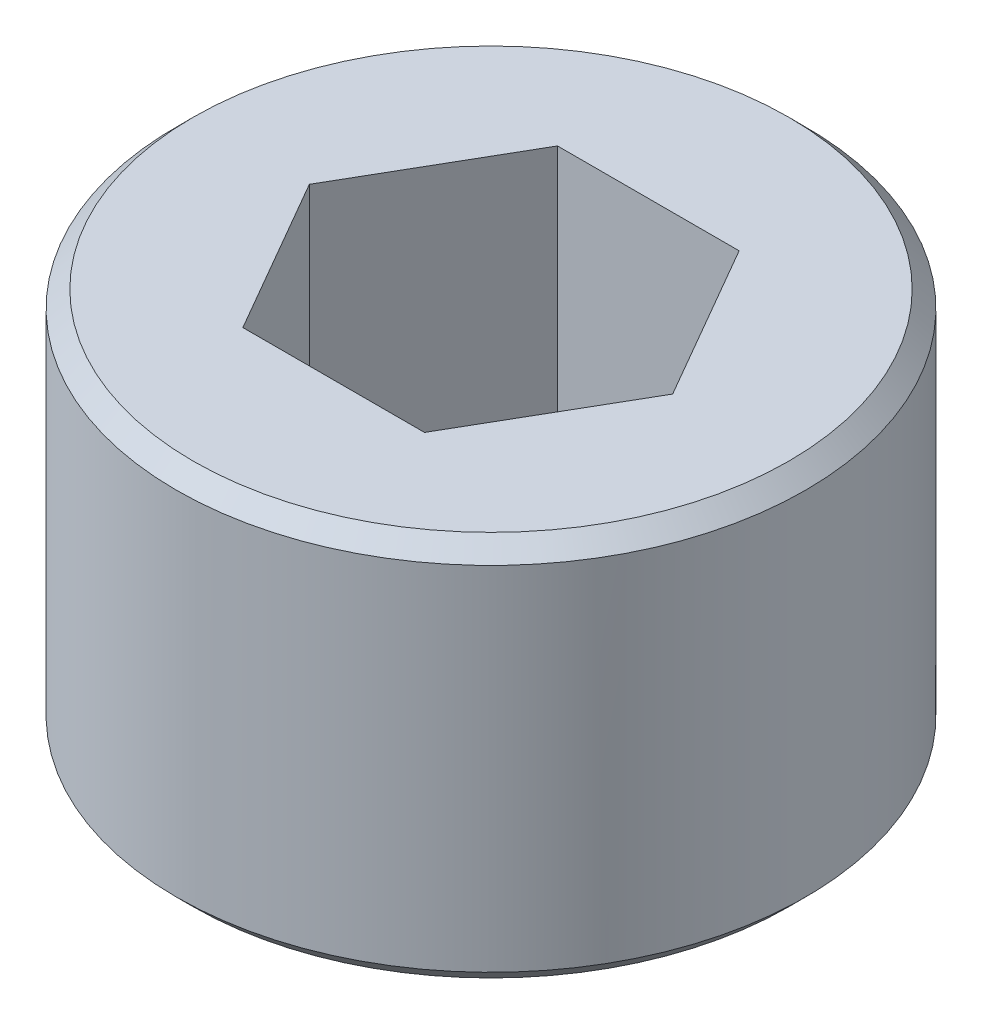
ISO-10303-21;
HEADER;
FILE_DESCRIPTION(('STEP AP214'),'2;1');
FILE_NAME('part.step','',(''),(''),'','','');
FILE_SCHEMA(('AUTOMOTIVE_DESIGN { 1 0 10303 214 1 1 1 1 }'));
ENDSEC;
DATA;
#1=APPLICATION_CONTEXT('core data for automotive mechanical design processes');
#2=APPLICATION_PROTOCOL_DEFINITION('international standard','automotive_design',2000,#1);
#3=PRODUCT_CONTEXT('',#1,'mechanical');
#4=PRODUCT('Part','Part','',(#3));
#5=PRODUCT_RELATED_PRODUCT_CATEGORY('part','',(#4));
#6=PRODUCT_DEFINITION_FORMATION('','',#4);
#7=PRODUCT_DEFINITION_CONTEXT('part definition',#1,'design');
#8=PRODUCT_DEFINITION('design','',#6,#7);
#9=PRODUCT_DEFINITION_SHAPE('','',#8);
#10=(LENGTH_UNIT() NAMED_UNIT(*) SI_UNIT(.MILLI.,.METRE.));
#11=(NAMED_UNIT(*) PLANE_ANGLE_UNIT() SI_UNIT($,.RADIAN.));
#12=(NAMED_UNIT(*) SI_UNIT($,.STERADIAN.) SOLID_ANGLE_UNIT());
#13=UNCERTAINTY_MEASURE_WITH_UNIT(LENGTH_MEASURE(1.E-05),#10,'distance_accuracy_value','');
#14=(GEOMETRIC_REPRESENTATION_CONTEXT(3) GLOBAL_UNCERTAINTY_ASSIGNED_CONTEXT((#13)) GLOBAL_UNIT_ASSIGNED_CONTEXT((#10,
#11,#12)) REPRESENTATION_CONTEXT('',''));
#15=CARTESIAN_POINT('',(0.,0.,0.));
#16=DIRECTION('',(0.,0.,1.));
#17=DIRECTION('',(1.,0.,0.));
#18=AXIS2_PLACEMENT_3D('',#15,#16,#17);
#19=CARTESIAN_POINT('',(-2.74963065701558,30.48,4.7625));
#20=DIRECTION('',(0.,0.,1.));
#21=DIRECTION('',(1.,0.,0.));
#22=AXIS2_PLACEMENT_3D('',#19,#20,#21);
#23=PLANE('',#22);
#24=DIRECTION('',(0.,1.,0.));
#25=VECTOR('',#24,1.);
#26=CARTESIAN_POINT('',(2.7496306570156,30.48,4.7625));
#27=LINE('',#26,#25);
#28=CARTESIAN_POINT('',(2.7496306570156,11.684,4.7625));
#29=VERTEX_POINT('',#28);
#30=CARTESIAN_POINT('',(2.7496306570156,0.,4.7625));
#31=VERTEX_POINT('',#30);
#32=EDGE_CURVE('E78',#29,#31,#27,.F.);
#33=ORIENTED_EDGE('',*,*,#32,.T.);
#34=DIRECTION('',(1.,0.,0.));
#35=VECTOR('',#34,1.);
#36=CARTESIAN_POINT('',(0.,0.,4.7625));
#37=LINE('',#36,#35);
#38=CARTESIAN_POINT('',(-2.74963065701558,0.,4.7625));
#39=VERTEX_POINT('',#38);
#40=EDGE_CURVE('E124',#31,#39,#37,.F.);
#41=ORIENTED_EDGE('',*,*,#40,.T.);
#42=DIRECTION('',(0.,1.,0.));
#43=VECTOR('',#42,1.);
#44=CARTESIAN_POINT('',(-2.74963065701559,30.48,4.76250000000001));
#45=LINE('',#44,#43);
#46=CARTESIAN_POINT('',(-2.74963065701558,11.684,4.7625));
#47=VERTEX_POINT('',#46);
#48=EDGE_CURVE('E101',#39,#47,#45,.T.);
#49=ORIENTED_EDGE('',*,*,#48,.T.);
#50=DIRECTION('',(1.,0.,0.));
#51=VECTOR('',#50,1.);
#52=CARTESIAN_POINT('',(0.,11.684,4.7625));
#53=LINE('',#52,#51);
#54=EDGE_CURVE('E86',#29,#47,#53,.F.);
#55=ORIENTED_EDGE('',*,*,#54,.F.);
#56=EDGE_LOOP('',(#33,#41,#49,#55));
#57=FACE_BOUND('',#56,.T.);
#58=ADVANCED_FACE('F17',(#57),#23,.F.);
#59=CARTESIAN_POINT('',(-5.49926131403119,30.48,0.));
#60=DIRECTION('',(-0.866025403784439,0.,0.5));
#61=DIRECTION('',(0.5,0.,0.866025403784439));
#62=AXIS2_PLACEMENT_3D('',#59,#60,#61);
#63=PLANE('',#62);
#64=ORIENTED_EDGE('',*,*,#48,.F.);
#65=DIRECTION('',(-0.500000000000002,0.,-0.866025403784437));
#66=VECTOR('',#65,1.);
#67=CARTESIAN_POINT('',(-2.74963065701558,0.,4.7625));
#68=LINE('',#67,#66);
#69=CARTESIAN_POINT('',(-5.49926131403119,0.,0.));
#70=VERTEX_POINT('',#69);
#71=EDGE_CURVE('E122',#39,#70,#68,.T.);
#72=ORIENTED_EDGE('',*,*,#71,.T.);
#73=DIRECTION('',(0.,1.,0.));
#74=VECTOR('',#73,1.);
#75=CARTESIAN_POINT('',(-5.49926131403118,30.48,0.));
#76=LINE('',#75,#74);
#77=CARTESIAN_POINT('',(-5.49926131403119,11.684,0.));
#78=VERTEX_POINT('',#77);
#79=EDGE_CURVE('E99',#70,#78,#76,.T.);
#80=ORIENTED_EDGE('',*,*,#79,.T.);
#81=DIRECTION('',(-0.500000000000002,0.,-0.866025403784437));
#82=VECTOR('',#81,1.);
#83=CARTESIAN_POINT('',(-2.74963065701558,11.684,4.7625));
#84=LINE('',#83,#82);
#85=EDGE_CURVE('E129',#47,#78,#84,.T.);
#86=ORIENTED_EDGE('',*,*,#85,.F.);
#87=EDGE_LOOP('',(#64,#72,#80,#86));
#88=FACE_BOUND('',#87,.T.);
#89=ADVANCED_FACE('F136',(#88),#63,.F.);
#90=CARTESIAN_POINT('',(-5.49926131403118,30.48,0.));
#91=DIRECTION('',(-0.866025403784438,0.,-0.500000000000001));
#92=DIRECTION('',(-0.500000000000001,0.,0.866025403784438));
#93=AXIS2_PLACEMENT_3D('',#90,#91,#92);
#94=PLANE('',#93);
#95=ORIENTED_EDGE('',*,*,#79,.F.);
#96=DIRECTION('',(0.500000000000003,0.,-0.866025403784437));
#97=VECTOR('',#96,1.);
#98=CARTESIAN_POINT('',(-5.49926131403119,0.,0.));
#99=LINE('',#98,#97);
#100=CARTESIAN_POINT('',(-2.74963065701558,0.,-4.7625));
#101=VERTEX_POINT('',#100);
#102=EDGE_CURVE('E120',#70,#101,#99,.T.);
#103=ORIENTED_EDGE('',*,*,#102,.T.);
#104=DIRECTION('',(0.,1.,0.));
#105=VECTOR('',#104,1.);
#106=CARTESIAN_POINT('',(-2.74963065701558,30.48,-4.7625));
#107=LINE('',#106,#105);
#108=CARTESIAN_POINT('',(-2.74963065701558,11.684,-4.7625));
#109=VERTEX_POINT('',#108);
#110=EDGE_CURVE('E97',#101,#109,#107,.T.);
#111=ORIENTED_EDGE('',*,*,#110,.T.);
#112=DIRECTION('',(0.500000000000003,0.,-0.866025403784437));
#113=VECTOR('',#112,1.);
#114=CARTESIAN_POINT('',(-5.49926131403119,11.684,0.));
#115=LINE('',#114,#113);
#116=EDGE_CURVE('E127',#78,#109,#115,.T.);
#117=ORIENTED_EDGE('',*,*,#116,.F.);
#118=EDGE_LOOP('',(#95,#103,#111,#117));
#119=FACE_BOUND('',#118,.T.);
#120=ADVANCED_FACE('F141',(#119),#94,.F.);
#121=CARTESIAN_POINT('',(-2.74963065701558,30.48,-4.7625));
#122=DIRECTION('',(0.,0.,-1.));
#123=DIRECTION('',(-1.,0.,0.));
#124=AXIS2_PLACEMENT_3D('',#121,#122,#123);
#125=PLANE('',#124);
#126=ORIENTED_EDGE('',*,*,#110,.F.);
#127=DIRECTION('',(1.,0.,0.));
#128=VECTOR('',#127,1.);
#129=CARTESIAN_POINT('',(0.,0.,-4.7625));
#130=LINE('',#129,#128);
#131=CARTESIAN_POINT('',(2.7496306570156,0.,-4.7625));
#132=VERTEX_POINT('',#131);
#133=EDGE_CURVE('E114',#101,#132,#130,.T.);
#134=ORIENTED_EDGE('',*,*,#133,.T.);
#135=DIRECTION('',(0.,1.,0.));
#136=VECTOR('',#135,1.);
#137=CARTESIAN_POINT('',(2.7496306570156,30.48,-4.7625));
#138=LINE('',#137,#136);
#139=CARTESIAN_POINT('',(2.7496306570156,11.684,-4.7625));
#140=VERTEX_POINT('',#139);
#141=EDGE_CURVE('E67',#132,#140,#138,.T.);
#142=ORIENTED_EDGE('',*,*,#141,.T.);
#143=DIRECTION('',(1.,0.,0.));
#144=VECTOR('',#143,1.);
#145=CARTESIAN_POINT('',(0.,11.684,-4.7625));
#146=LINE('',#145,#144);
#147=EDGE_CURVE('E91',#109,#140,#146,.T.);
#148=ORIENTED_EDGE('',*,*,#147,.F.);
#149=EDGE_LOOP('',(#126,#134,#142,#148));
#150=FACE_BOUND('',#149,.T.);
#151=ADVANCED_FACE('F144',(#150),#125,.F.);
#152=CARTESIAN_POINT('',(2.7496306570156,30.48,-4.7625));
#153=DIRECTION('',(0.866025403784439,0.,-0.5));
#154=DIRECTION('',(-0.5,0.,-0.866025403784439));
#155=AXIS2_PLACEMENT_3D('',#152,#153,#154);
#156=PLANE('',#155);
#157=ORIENTED_EDGE('',*,*,#141,.F.);
#158=DIRECTION('',(0.500000000000001,0.,0.866025403784438));
#159=VECTOR('',#158,1.);
#160=CARTESIAN_POINT('',(2.7496306570156,0.,-4.7625));
#161=LINE('',#160,#159);
#162=CARTESIAN_POINT('',(5.4992613140312,0.,0.));
#163=VERTEX_POINT('',#162);
#164=EDGE_CURVE('E35',#132,#163,#161,.T.);
#165=ORIENTED_EDGE('',*,*,#164,.T.);
#166=DIRECTION('',(0.,1.,0.));
#167=VECTOR('',#166,1.);
#168=CARTESIAN_POINT('',(5.4992613140312,30.48,0.));
#169=LINE('',#168,#167);
#170=CARTESIAN_POINT('',(5.4992613140312,11.684,0.));
#171=VERTEX_POINT('',#170);
#172=EDGE_CURVE('E69',#163,#171,#169,.T.);
#173=ORIENTED_EDGE('',*,*,#172,.T.);
#174=DIRECTION('',(0.500000000000001,0.,0.866025403784438));
#175=VECTOR('',#174,1.);
#176=CARTESIAN_POINT('',(2.7496306570156,11.684,-4.7625));
#177=LINE('',#176,#175);
#178=EDGE_CURVE('E73',#140,#171,#177,.T.);
#179=ORIENTED_EDGE('',*,*,#178,.F.);
#180=EDGE_LOOP('',(#157,#165,#173,#179));
#181=FACE_BOUND('',#180,.T.);
#182=ADVANCED_FACE('F71',(#181),#156,.F.);
#183=CARTESIAN_POINT('',(2.7496306570156,30.48,4.7625));
#184=DIRECTION('',(0.866025403784438,0.,0.500000000000001));
#185=DIRECTION('',(0.500000000000001,0.,-0.866025403784438));
#186=AXIS2_PLACEMENT_3D('',#183,#184,#185);
#187=PLANE('',#186);
#188=ORIENTED_EDGE('',*,*,#172,.F.);
#189=DIRECTION('',(-0.500000000000001,0.,0.866025403784438));
#190=VECTOR('',#189,1.);
#191=CARTESIAN_POINT('',(5.4992613140312,0.,0.));
#192=LINE('',#191,#190);
#193=EDGE_CURVE('E109',#163,#31,#192,.T.);
#194=ORIENTED_EDGE('',*,*,#193,.T.);
#195=ORIENTED_EDGE('',*,*,#32,.F.);
#196=DIRECTION('',(-0.500000000000001,0.,0.866025403784438));
#197=VECTOR('',#196,1.);
#198=CARTESIAN_POINT('',(5.4992613140312,11.684,0.));
#199=LINE('',#198,#197);
#200=EDGE_CURVE('E81',#171,#29,#199,.T.);
#201=ORIENTED_EDGE('',*,*,#200,.F.);
#202=EDGE_LOOP('',(#188,#194,#195,#201));
#203=FACE_BOUND('',#202,.T.);
#204=ADVANCED_FACE('F82',(#203),#187,.F.);
#205=CARTESIAN_POINT('',(0.,11.684,0.));
#206=DIRECTION('',(0.,1.,0.));
#207=DIRECTION('',(0.,0.,1.));
#208=AXIS2_PLACEMENT_3D('',#205,#206,#207);
#209=PLANE('',#208);
#210=ORIENTED_EDGE('',*,*,#116,.T.);
#211=ORIENTED_EDGE('',*,*,#147,.T.);
#212=ORIENTED_EDGE('',*,*,#178,.T.);
#213=ORIENTED_EDGE('',*,*,#200,.T.);
#214=ORIENTED_EDGE('',*,*,#54,.T.);
#215=ORIENTED_EDGE('',*,*,#85,.T.);
#216=EDGE_LOOP('',(#210,#211,#212,#213,#214,#215));
#217=FACE_BOUND('',#216,.T.);
#218=CARTESIAN_POINT('',(0.,11.684,0.));
#219=DIRECTION('',(0.,-1.,0.));
#220=DIRECTION('',(1.,0.,0.));
#221=AXIS2_PLACEMENT_3D('',#218,#219,#220);
#222=CIRCLE('',#221,9.01699999999999);
#223=CARTESIAN_POINT('',(9.01699999999999,11.684,0.));
#224=VERTEX_POINT('',#223);
#225=EDGE_CURVE('E20',#224,#224,#222,.T.);
#226=ORIENTED_EDGE('',*,*,#225,.F.);
#227=EDGE_LOOP('',(#226));
#228=FACE_BOUND('',#227,.T.);
#229=ADVANCED_FACE('F89',(#217,#228),#209,.T.);
#230=CARTESIAN_POINT('',(0.,0.,0.));
#231=DIRECTION('',(0.,1.,0.));
#232=DIRECTION('',(0.,0.,1.));
#233=AXIS2_PLACEMENT_3D('',#230,#231,#232);
#234=PLANE('',#233);
#235=CARTESIAN_POINT('',(0.,0.,0.));
#236=DIRECTION('',(0.,1.,0.));
#237=DIRECTION('',(0.,0.,1.));
#238=AXIS2_PLACEMENT_3D('',#235,#236,#237);
#239=CIRCLE('',#238,9.01699999999999);
#240=CARTESIAN_POINT('',(0.,0.,9.017));
#241=VERTEX_POINT('',#240);
#242=EDGE_CURVE('E102',#241,#241,#239,.T.);
#243=ORIENTED_EDGE('',*,*,#242,.F.);
#244=EDGE_LOOP('',(#243));
#245=FACE_BOUND('',#244,.T.);
#246=ORIENTED_EDGE('',*,*,#164,.F.);
#247=ORIENTED_EDGE('',*,*,#133,.F.);
#248=ORIENTED_EDGE('',*,*,#102,.F.);
#249=ORIENTED_EDGE('',*,*,#71,.F.);
#250=ORIENTED_EDGE('',*,*,#40,.F.);
#251=ORIENTED_EDGE('',*,*,#193,.F.);
#252=EDGE_LOOP('',(#246,#247,#248,#249,#250,#251));
#253=FACE_BOUND('',#252,.T.);
#254=ADVANCED_FACE('F168',(#245,#253),#234,.F.);
#255=CARTESIAN_POINT('',(0.,11.176,0.));
#256=DIRECTION('',(0.,-1.,0.));
#257=DIRECTION('',(1.,0.,0.));
#258=AXIS2_PLACEMENT_3D('',#255,#256,#257);
#259=CONICAL_SURFACE('',#258,9.525,0.785398163397459);
#260=ORIENTED_EDGE('',*,*,#225,.T.);
#261=EDGE_LOOP('',(#260));
#262=FACE_BOUND('',#261,.T.);
#263=CARTESIAN_POINT('',(0.,11.176,0.));
#264=DIRECTION('',(0.,1.,0.));
#265=DIRECTION('',(0.,0.,1.));
#266=AXIS2_PLACEMENT_3D('',#263,#264,#265);
#267=CIRCLE('',#266,9.525);
#268=CARTESIAN_POINT('',(0.,11.176,9.525));
#269=VERTEX_POINT('',#268);
#270=EDGE_CURVE('E26',#269,#269,#267,.F.);
#271=ORIENTED_EDGE('',*,*,#270,.F.);
#272=EDGE_LOOP('',(#271));
#273=FACE_BOUND('',#272,.T.);
#274=ADVANCED_FACE('F162',(#262,#273),#259,.T.);
#275=CARTESIAN_POINT('',(0.,0.508000000000002,0.));
#276=DIRECTION('',(0.,1.,0.));
#277=DIRECTION('',(0.,0.,1.));
#278=AXIS2_PLACEMENT_3D('',#275,#276,#277);
#279=CONICAL_SURFACE('',#278,9.52499999999999,0.78539816339745);
#280=ORIENTED_EDGE('',*,*,#242,.T.);
#281=EDGE_LOOP('',(#280));
#282=FACE_BOUND('',#281,.T.);
#283=CARTESIAN_POINT('',(0.,0.508000000000002,0.));
#284=DIRECTION('',(0.,1.,0.));
#285=DIRECTION('',(0.,0.,1.));
#286=AXIS2_PLACEMENT_3D('',#283,#284,#285);
#287=CIRCLE('',#286,9.525);
#288=CARTESIAN_POINT('',(0.,0.508000000000002,9.525));
#289=VERTEX_POINT('',#288);
#290=EDGE_CURVE('E11',#289,#289,#287,.T.);
#291=ORIENTED_EDGE('',*,*,#290,.F.);
#292=EDGE_LOOP('',(#291));
#293=FACE_BOUND('',#292,.T.);
#294=ADVANCED_FACE('F156',(#282,#293),#279,.T.);
#295=CARTESIAN_POINT('',(0.,11.684,0.));
#296=DIRECTION('',(0.,1.,0.));
#297=DIRECTION('',(0.,0.,1.));
#298=AXIS2_PLACEMENT_3D('',#295,#296,#297);
#299=CYLINDRICAL_SURFACE('',#298,9.525);
#300=ORIENTED_EDGE('',*,*,#290,.T.);
#301=EDGE_LOOP('',(#300));
#302=FACE_BOUND('',#301,.T.);
#303=ORIENTED_EDGE('',*,*,#270,.T.);
#304=EDGE_LOOP('',(#303));
#305=FACE_BOUND('',#304,.T.);
#306=ADVANCED_FACE('F154',(#302,#305),#299,.T.);
#307=CLOSED_SHELL('',(#58,#89,#120,#151,#182,#204,#229,#254,#274,#294,#306));
#308=MANIFOLD_SOLID_BREP('B1',#307);
#309=ADVANCED_BREP_SHAPE_REPRESENTATION('',(#18,#308),#14);
#310=SHAPE_DEFINITION_REPRESENTATION(#9,#309);
ENDSEC;
END-ISO-10303-21;
